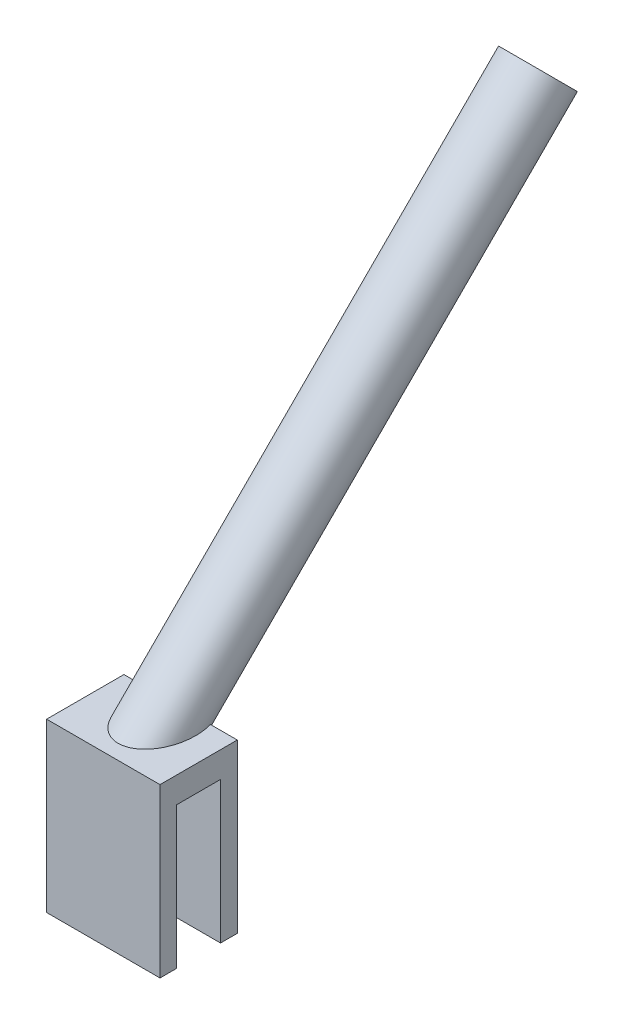
ISO-10303-21;
HEADER;
FILE_DESCRIPTION(('STEP AP214'),'2;1');
FILE_NAME('part.step','',(''),(''),'','','');
FILE_SCHEMA(('AUTOMOTIVE_DESIGN { 1 0 10303 214 1 1 1 1 }'));
ENDSEC;
DATA;
#1=APPLICATION_CONTEXT('core data for automotive mechanical design processes');
#2=APPLICATION_PROTOCOL_DEFINITION('international standard','automotive_design',2000,#1);
#3=PRODUCT_CONTEXT('',#1,'mechanical');
#4=PRODUCT('Part','Part','',(#3));
#5=PRODUCT_RELATED_PRODUCT_CATEGORY('part','',(#4));
#6=PRODUCT_DEFINITION_FORMATION('','',#4);
#7=PRODUCT_DEFINITION_CONTEXT('part definition',#1,'design');
#8=PRODUCT_DEFINITION('design','',#6,#7);
#9=PRODUCT_DEFINITION_SHAPE('','',#8);
#10=(LENGTH_UNIT() NAMED_UNIT(*) SI_UNIT(.MILLI.,.METRE.));
#11=(NAMED_UNIT(*) PLANE_ANGLE_UNIT() SI_UNIT($,.RADIAN.));
#12=(NAMED_UNIT(*) SI_UNIT($,.STERADIAN.) SOLID_ANGLE_UNIT());
#13=UNCERTAINTY_MEASURE_WITH_UNIT(LENGTH_MEASURE(1.E-05),#10,'distance_accuracy_value','');
#14=(GEOMETRIC_REPRESENTATION_CONTEXT(3) GLOBAL_UNCERTAINTY_ASSIGNED_CONTEXT((#13)) GLOBAL_UNIT_ASSIGNED_CONTEXT((#10,
#11,#12)) REPRESENTATION_CONTEXT('',''));
#15=CARTESIAN_POINT('',(0.,0.,0.));
#16=DIRECTION('',(0.,0.,1.));
#17=DIRECTION('',(1.,0.,0.));
#18=AXIS2_PLACEMENT_3D('',#15,#16,#17);
#19=CARTESIAN_POINT('',(0.,65.,0.));
#20=DIRECTION('',(0.,-1.,0.));
#21=DIRECTION('',(0.,0.,-1.));
#22=AXIS2_PLACEMENT_3D('',#19,#20,#21);
#23=PLANE('',#22);
#24=DIRECTION('',(-1.,0.,0.));
#25=VECTOR('',#24,1.);
#26=CARTESIAN_POINT('',(-22.,65.,-15.));
#27=LINE('',#26,#25);
#28=CARTESIAN_POINT('',(22.,65.,-15.));
#29=VERTEX_POINT('',#28);
#30=CARTESIAN_POINT('',(11.6050473823319,65.,-15.));
#31=VERTEX_POINT('',#30);
#32=EDGE_CURVE('E170',#29,#31,#27,.T.);
#33=ORIENTED_EDGE('',*,*,#32,.T.);
#34=CARTESIAN_POINT('',(-7.86220424258403E-13,65.,-8.43145750507585));
#35=DIRECTION('',(0.,-1.,0.));
#36=DIRECTION('',(0.,0.,1.));
#37=AXIS2_PLACEMENT_3D('',#34,#35,#36);
#38=ELLIPSE('',#37,17.6776695296636,12.5);
#39=CARTESIAN_POINT('',(-11.6050473823335,65.,-15.));
#40=VERTEX_POINT('',#39);
#41=EDGE_CURVE('E11',#40,#31,#38,.F.);
#42=ORIENTED_EDGE('',*,*,#41,.F.);
#43=CARTESIAN_POINT('',(-22.,65.,-15.));
#44=VERTEX_POINT('',#43);
#45=EDGE_CURVE('E187',#40,#44,#27,.T.);
#46=ORIENTED_EDGE('',*,*,#45,.T.);
#47=DIRECTION('',(0.,0.,1.));
#48=VECTOR('',#47,1.);
#49=CARTESIAN_POINT('',(-22.,65.,15.));
#50=LINE('',#49,#48);
#51=CARTESIAN_POINT('',(-22.,65.,15.));
#52=VERTEX_POINT('',#51);
#53=EDGE_CURVE('E186',#44,#52,#50,.T.);
#54=ORIENTED_EDGE('',*,*,#53,.T.);
#55=DIRECTION('',(1.,0.,0.));
#56=VECTOR('',#55,1.);
#57=CARTESIAN_POINT('',(-22.,65.,15.));
#58=LINE('',#57,#56);
#59=CARTESIAN_POINT('',(22.,65.,15.));
#60=VERTEX_POINT('',#59);
#61=EDGE_CURVE('E157',#52,#60,#58,.T.);
#62=ORIENTED_EDGE('',*,*,#61,.T.);
#63=DIRECTION('',(0.,0.,-1.));
#64=VECTOR('',#63,1.);
#65=CARTESIAN_POINT('',(22.,65.,15.));
#66=LINE('',#65,#64);
#67=EDGE_CURVE('E151',#60,#29,#66,.T.);
#68=ORIENTED_EDGE('',*,*,#67,.T.);
#69=EDGE_LOOP('',(#33,#42,#46,#54,#62,#68));
#70=FACE_BOUND('',#69,.T.);
#71=ADVANCED_FACE('F39',(#70),#23,.F.);
#72=CARTESIAN_POINT('',(0.,0.,0.));
#73=DIRECTION('',(0.,-1.,0.));
#74=DIRECTION('',(0.,0.,-1.));
#75=AXIS2_PLACEMENT_3D('',#72,#73,#74);
#76=PLANE('',#75);
#77=DIRECTION('',(1.,0.,0.));
#78=VECTOR('',#77,1.);
#79=CARTESIAN_POINT('',(-22.,0.,8.5));
#80=LINE('',#79,#78);
#81=CARTESIAN_POINT('',(-22.,0.,8.5));
#82=VERTEX_POINT('',#81);
#83=CARTESIAN_POINT('',(22.,0.,8.5));
#84=VERTEX_POINT('',#83);
#85=EDGE_CURVE('E108',#82,#84,#80,.T.);
#86=ORIENTED_EDGE('',*,*,#85,.T.);
#87=DIRECTION('',(0.,0.,-1.));
#88=VECTOR('',#87,1.);
#89=CARTESIAN_POINT('',(22.,0.,15.));
#90=LINE('',#89,#88);
#91=CARTESIAN_POINT('',(22.,0.,15.));
#92=VERTEX_POINT('',#91);
#93=EDGE_CURVE('E145',#92,#84,#90,.T.);
#94=ORIENTED_EDGE('',*,*,#93,.F.);
#95=DIRECTION('',(1.,0.,0.));
#96=VECTOR('',#95,1.);
#97=CARTESIAN_POINT('',(-22.,0.,15.));
#98=LINE('',#97,#96);
#99=CARTESIAN_POINT('',(-22.,0.,15.));
#100=VERTEX_POINT('',#99);
#101=EDGE_CURVE('E137',#100,#92,#98,.T.);
#102=ORIENTED_EDGE('',*,*,#101,.F.);
#103=DIRECTION('',(0.,0.,1.));
#104=VECTOR('',#103,1.);
#105=CARTESIAN_POINT('',(-22.,0.,15.));
#106=LINE('',#105,#104);
#107=EDGE_CURVE('E127',#82,#100,#106,.T.);
#108=ORIENTED_EDGE('',*,*,#107,.F.);
#109=EDGE_LOOP('',(#86,#94,#102,#108));
#110=FACE_BOUND('',#109,.T.);
#111=ADVANCED_FACE('F136',(#110),#76,.T.);
#112=CARTESIAN_POINT('',(22.,65.,15.));
#113=DIRECTION('',(-1.,0.,0.));
#114=DIRECTION('',(0.,0.,1.));
#115=AXIS2_PLACEMENT_3D('',#112,#113,#114);
#116=PLANE('',#115);
#117=ORIENTED_EDGE('',*,*,#93,.T.);
#118=DIRECTION('',(0.,1.,0.));
#119=VECTOR('',#118,1.);
#120=CARTESIAN_POINT('',(22.,65.,8.5));
#121=LINE('',#120,#119);
#122=CARTESIAN_POINT('',(22.,55.,8.5));
#123=VERTEX_POINT('',#122);
#124=EDGE_CURVE('E115',#84,#123,#121,.T.);
#125=ORIENTED_EDGE('',*,*,#124,.T.);
#126=DIRECTION('',(0.,0.,-1.));
#127=VECTOR('',#126,1.);
#128=CARTESIAN_POINT('',(22.,55.,15.));
#129=LINE('',#128,#127);
#130=CARTESIAN_POINT('',(22.,55.,-8.5));
#131=VERTEX_POINT('',#130);
#132=EDGE_CURVE('E182',#123,#131,#129,.T.);
#133=ORIENTED_EDGE('',*,*,#132,.T.);
#134=DIRECTION('',(0.,-1.,0.));
#135=VECTOR('',#134,1.);
#136=CARTESIAN_POINT('',(22.,65.,-8.5));
#137=LINE('',#136,#135);
#138=CARTESIAN_POINT('',(22.,0.,-8.5));
#139=VERTEX_POINT('',#138);
#140=EDGE_CURVE('E178',#131,#139,#137,.T.);
#141=ORIENTED_EDGE('',*,*,#140,.T.);
#142=CARTESIAN_POINT('',(22.,0.,-15.));
#143=VERTEX_POINT('',#142);
#144=EDGE_CURVE('E176',#139,#143,#90,.T.);
#145=ORIENTED_EDGE('',*,*,#144,.T.);
#146=DIRECTION('',(0.,-1.,0.));
#147=VECTOR('',#146,1.);
#148=CARTESIAN_POINT('',(22.,65.,-15.));
#149=LINE('',#148,#147);
#150=EDGE_CURVE('E48',#29,#143,#149,.T.);
#151=ORIENTED_EDGE('',*,*,#150,.F.);
#152=ORIENTED_EDGE('',*,*,#67,.F.);
#153=DIRECTION('',(0.,-1.,0.));
#154=VECTOR('',#153,1.);
#155=CARTESIAN_POINT('',(22.,65.,15.));
#156=LINE('',#155,#154);
#157=EDGE_CURVE('E152',#60,#92,#156,.T.);
#158=ORIENTED_EDGE('',*,*,#157,.T.);
#159=EDGE_LOOP('',(#117,#125,#133,#141,#145,#151,#152,#158));
#160=FACE_BOUND('',#159,.T.);
#161=ADVANCED_FACE('F41',(#160),#116,.F.);
#162=CARTESIAN_POINT('',(-22.,65.,-15.));
#163=DIRECTION('',(0.,0.,1.));
#164=DIRECTION('',(1.,0.,0.));
#165=AXIS2_PLACEMENT_3D('',#162,#163,#164);
#166=PLANE('',#165);
#167=CARTESIAN_POINT('',(-8.66557240810592E-13,71.5685424949242,-15.));
#168=DIRECTION('',(0.,0.,1.));
#169=DIRECTION('',(0.,-1.,0.));
#170=AXIS2_PLACEMENT_3D('',#167,#168,#169);
#171=ELLIPSE('',#170,17.6776695296638,12.5);
#172=EDGE_CURVE('E133',#31,#40,#171,.F.);
#173=ORIENTED_EDGE('',*,*,#172,.F.);
#174=ORIENTED_EDGE('',*,*,#32,.F.);
#175=ORIENTED_EDGE('',*,*,#150,.T.);
#176=DIRECTION('',(-1.,0.,0.));
#177=VECTOR('',#176,1.);
#178=CARTESIAN_POINT('',(-22.,0.,-15.));
#179=LINE('',#178,#177);
#180=CARTESIAN_POINT('',(-22.,0.,-15.));
#181=VERTEX_POINT('',#180);
#182=EDGE_CURVE('E140',#143,#181,#179,.T.);
#183=ORIENTED_EDGE('',*,*,#182,.T.);
#184=DIRECTION('',(0.,-1.,0.));
#185=VECTOR('',#184,1.);
#186=CARTESIAN_POINT('',(-22.,65.,-15.));
#187=LINE('',#186,#185);
#188=EDGE_CURVE('E160',#44,#181,#187,.T.);
#189=ORIENTED_EDGE('',*,*,#188,.F.);
#190=ORIENTED_EDGE('',*,*,#45,.F.);
#191=EDGE_LOOP('',(#173,#174,#175,#183,#189,#190));
#192=FACE_BOUND('',#191,.T.);
#193=ADVANCED_FACE('F167',(#192),#166,.F.);
#194=CARTESIAN_POINT('',(-22.,65.,15.));
#195=DIRECTION('',(1.,0.,0.));
#196=DIRECTION('',(0.,0.,-1.));
#197=AXIS2_PLACEMENT_3D('',#194,#195,#196);
#198=PLANE('',#197);
#199=DIRECTION('',(0.,0.,1.));
#200=VECTOR('',#199,1.);
#201=CARTESIAN_POINT('',(-22.,55.,8.5));
#202=LINE('',#201,#200);
#203=CARTESIAN_POINT('',(-22.,55.,-8.5));
#204=VERTEX_POINT('',#203);
#205=CARTESIAN_POINT('',(-22.,55.,8.5));
#206=VERTEX_POINT('',#205);
#207=EDGE_CURVE('E122',#204,#206,#202,.T.);
#208=ORIENTED_EDGE('',*,*,#207,.T.);
#209=DIRECTION('',(0.,-1.,0.));
#210=VECTOR('',#209,1.);
#211=CARTESIAN_POINT('',(-22.,0.,8.5));
#212=LINE('',#211,#210);
#213=EDGE_CURVE('E112',#206,#82,#212,.T.);
#214=ORIENTED_EDGE('',*,*,#213,.T.);
#215=ORIENTED_EDGE('',*,*,#107,.T.);
#216=DIRECTION('',(0.,-1.,0.));
#217=VECTOR('',#216,1.);
#218=CARTESIAN_POINT('',(-22.,65.,15.));
#219=LINE('',#218,#217);
#220=EDGE_CURVE('E156',#52,#100,#219,.T.);
#221=ORIENTED_EDGE('',*,*,#220,.F.);
#222=ORIENTED_EDGE('',*,*,#53,.F.);
#223=ORIENTED_EDGE('',*,*,#188,.T.);
#224=CARTESIAN_POINT('',(-22.,0.,-8.5));
#225=VERTEX_POINT('',#224);
#226=EDGE_CURVE('E139',#181,#225,#106,.T.);
#227=ORIENTED_EDGE('',*,*,#226,.T.);
#228=DIRECTION('',(0.,1.,0.));
#229=VECTOR('',#228,1.);
#230=CARTESIAN_POINT('',(-22.,0.,-8.5));
#231=LINE('',#230,#229);
#232=EDGE_CURVE('E132',#225,#204,#231,.T.);
#233=ORIENTED_EDGE('',*,*,#232,.T.);
#234=EDGE_LOOP('',(#208,#214,#215,#221,#222,#223,#227,#233));
#235=FACE_BOUND('',#234,.T.);
#236=ADVANCED_FACE('F125',(#235),#198,.F.);
#237=CARTESIAN_POINT('',(-22.,65.,15.));
#238=DIRECTION('',(0.,0.,-1.));
#239=DIRECTION('',(-1.,0.,0.));
#240=AXIS2_PLACEMENT_3D('',#237,#238,#239);
#241=PLANE('',#240);
#242=ORIENTED_EDGE('',*,*,#101,.T.);
#243=ORIENTED_EDGE('',*,*,#157,.F.);
#244=ORIENTED_EDGE('',*,*,#61,.F.);
#245=ORIENTED_EDGE('',*,*,#220,.T.);
#246=EDGE_LOOP('',(#242,#243,#244,#245));
#247=FACE_BOUND('',#246,.T.);
#248=ADVANCED_FACE('F229',(#247),#241,.F.);
#249=DIRECTION('',(1.,0.,0.));
#250=VECTOR('',#249,1.);
#251=CARTESIAN_POINT('',(-22.,0.,-8.5));
#252=LINE('',#251,#250);
#253=EDGE_CURVE('E121',#225,#139,#252,.T.);
#254=ORIENTED_EDGE('',*,*,#253,.F.);
#255=ORIENTED_EDGE('',*,*,#226,.F.);
#256=ORIENTED_EDGE('',*,*,#182,.F.);
#257=ORIENTED_EDGE('',*,*,#144,.F.);
#258=EDGE_LOOP('',(#254,#255,#256,#257));
#259=FACE_BOUND('',#258,.T.);
#260=ADVANCED_FACE('F184',(#259),#76,.T.);
#261=CARTESIAN_POINT('',(-22.,55.,8.5));
#262=DIRECTION('',(0.,1.,0.));
#263=DIRECTION('',(0.,0.,1.));
#264=AXIS2_PLACEMENT_3D('',#261,#262,#263);
#265=PLANE('',#264);
#266=DIRECTION('',(1.,0.,0.));
#267=VECTOR('',#266,1.);
#268=CARTESIAN_POINT('',(-22.,55.,8.5));
#269=LINE('',#268,#267);
#270=EDGE_CURVE('E204',#206,#123,#269,.T.);
#271=ORIENTED_EDGE('',*,*,#270,.F.);
#272=ORIENTED_EDGE('',*,*,#207,.F.);
#273=DIRECTION('',(1.,0.,0.));
#274=VECTOR('',#273,1.);
#275=CARTESIAN_POINT('',(-22.,55.,-8.5));
#276=LINE('',#275,#274);
#277=EDGE_CURVE('E207',#204,#131,#276,.T.);
#278=ORIENTED_EDGE('',*,*,#277,.T.);
#279=ORIENTED_EDGE('',*,*,#132,.F.);
#280=EDGE_LOOP('',(#271,#272,#278,#279));
#281=FACE_BOUND('',#280,.T.);
#282=ADVANCED_FACE('F240',(#281),#265,.F.);
#283=CARTESIAN_POINT('',(-22.,0.,8.5));
#284=DIRECTION('',(0.,0.,1.));
#285=DIRECTION('',(1.,0.,0.));
#286=AXIS2_PLACEMENT_3D('',#283,#284,#285);
#287=PLANE('',#286);
#288=ORIENTED_EDGE('',*,*,#85,.F.);
#289=ORIENTED_EDGE('',*,*,#213,.F.);
#290=ORIENTED_EDGE('',*,*,#270,.T.);
#291=ORIENTED_EDGE('',*,*,#124,.F.);
#292=EDGE_LOOP('',(#288,#289,#290,#291));
#293=FACE_BOUND('',#292,.T.);
#294=ADVANCED_FACE('F110',(#293),#287,.F.);
#295=CARTESIAN_POINT('',(-22.,0.,-8.5));
#296=DIRECTION('',(0.,0.,-1.));
#297=DIRECTION('',(-1.,0.,0.));
#298=AXIS2_PLACEMENT_3D('',#295,#296,#297);
#299=PLANE('',#298);
#300=ORIENTED_EDGE('',*,*,#277,.F.);
#301=ORIENTED_EDGE('',*,*,#232,.F.);
#302=ORIENTED_EDGE('',*,*,#253,.T.);
#303=ORIENTED_EDGE('',*,*,#140,.F.);
#304=EDGE_LOOP('',(#300,#301,#302,#303));
#305=FACE_BOUND('',#304,.T.);
#306=ADVANCED_FACE('F282',(#305),#299,.F.);
#307=CARTESIAN_POINT('',(-2.56287933985159E-12,210.264152687438,-153.695610192512));
#308=DIRECTION('',(0.,-0.707106781186551,0.707106781186544));
#309=DIRECTION('',(0.,-0.707106781186544,-0.707106781186551));
#310=AXIS2_PLACEMENT_3D('',#307,#308,#309);
#311=CYLINDRICAL_SURFACE('',#310,12.5);
#312=CARTESIAN_POINT('',(-2.56287933985159E-12,210.264152687438,-153.695610192512));
#313=DIRECTION('',(0.,0.707106781186551,-0.707106781186544));
#314=DIRECTION('',(0.,0.707106781186544,0.707106781186551));
#315=AXIS2_PLACEMENT_3D('',#312,#313,#314);
#316=CIRCLE('',#315,12.5);
#317=CARTESIAN_POINT('',(-2.56287933985159E-12,219.10298745227,-144.856775427681));
#318=VERTEX_POINT('',#317);
#319=EDGE_CURVE('E192',#318,#318,#316,.T.);
#320=ORIENTED_EDGE('',*,*,#319,.F.);
#321=EDGE_LOOP('',(#320));
#322=FACE_BOUND('',#321,.T.);
#323=ORIENTED_EDGE('',*,*,#41,.T.);
#324=ORIENTED_EDGE('',*,*,#172,.T.);
#325=EDGE_LOOP('',(#323,#324));
#326=FACE_BOUND('',#325,.T.);
#327=ADVANCED_FACE('F190',(#322,#326),#311,.T.);
#328=CARTESIAN_POINT('',(-2.56287933985159E-12,210.264152687438,-153.695610192512));
#329=DIRECTION('',(0.,0.707106781186551,-0.707106781186544));
#330=DIRECTION('',(0.,0.707106781186544,0.707106781186551));
#331=AXIS2_PLACEMENT_3D('',#328,#329,#330);
#332=PLANE('',#331);
#333=CARTESIAN_POINT('',(-2.56287933985159E-12,210.264152687438,-153.695610192512));
#334=DIRECTION('',(0.,0.707106781186551,-0.707106781186544));
#335=DIRECTION('',(0.,0.707106781186544,0.707106781186551));
#336=AXIS2_PLACEMENT_3D('',#333,#334,#335);
#337=CIRCLE('',#336,10.);
#338=CARTESIAN_POINT('',(-2.56287933985159E-12,217.335220499303,-146.624542380647));
#339=VERTEX_POINT('',#338);
#340=EDGE_CURVE('E354',#339,#339,#337,.T.);
#341=ORIENTED_EDGE('',*,*,#340,.F.);
#342=EDGE_LOOP('',(#341));
#343=FACE_BOUND('',#342,.T.);
#344=ORIENTED_EDGE('',*,*,#319,.T.);
#345=EDGE_LOOP('',(#344));
#346=FACE_BOUND('',#345,.T.);
#347=ADVANCED_FACE('F294',(#343,#346),#332,.T.);
#348=CARTESIAN_POINT('',(-8.76461382999908E-13,72.3783303560605,-15.8097878611363));
#349=DIRECTION('',(0.,0.707106781186551,-0.707106781186544));
#350=DIRECTION('',(0.,0.707106781186544,0.707106781186551));
#351=AXIS2_PLACEMENT_3D('',#348,#349,#350);
#352=CYLINDRICAL_SURFACE('',#351,10.);
#353=CARTESIAN_POINT('',(-8.76461382999908E-13,72.3783303560605,-15.8097878611363));
#354=DIRECTION('',(0.,0.707106781186551,-0.707106781186544));
#355=DIRECTION('',(0.,0.707106781186544,0.707106781186551));
#356=AXIS2_PLACEMENT_3D('',#353,#354,#355);
#357=CIRCLE('',#356,10.);
#358=CARTESIAN_POINT('',(-8.76461382999908E-13,79.449398167926,-8.73872004927076));
#359=VERTEX_POINT('',#358);
#360=EDGE_CURVE('E196',#359,#359,#357,.T.);
#361=ORIENTED_EDGE('',*,*,#360,.F.);
#362=EDGE_LOOP('',(#361));
#363=FACE_BOUND('',#362,.T.);
#364=ORIENTED_EDGE('',*,*,#340,.T.);
#365=EDGE_LOOP('',(#364));
#366=FACE_BOUND('',#365,.T.);
#367=ADVANCED_FACE('F302',(#363,#366),#352,.F.);
#368=CARTESIAN_POINT('',(-8.76461382999908E-13,72.3783303560605,-15.8097878611363));
#369=DIRECTION('',(0.,0.707106781186551,-0.707106781186544));
#370=DIRECTION('',(0.,0.707106781186544,0.707106781186551));
#371=AXIS2_PLACEMENT_3D('',#368,#369,#370);
#372=PLANE('',#371);
#373=ORIENTED_EDGE('',*,*,#360,.T.);
#374=EDGE_LOOP('',(#373));
#375=FACE_BOUND('',#374,.T.);
#376=ADVANCED_FACE('F310',(#375),#372,.T.);
#377=CLOSED_SHELL('',(#71,#111,#161,#193,#236,#248,#260,#282,#294,#306,#327,#347,#367,#376));
#378=MANIFOLD_SOLID_BREP('B2',#377);
#379=ADVANCED_BREP_SHAPE_REPRESENTATION('',(#18,#378),#14);
#380=SHAPE_DEFINITION_REPRESENTATION(#9,#379);
ENDSEC;
END-ISO-10303-21;
